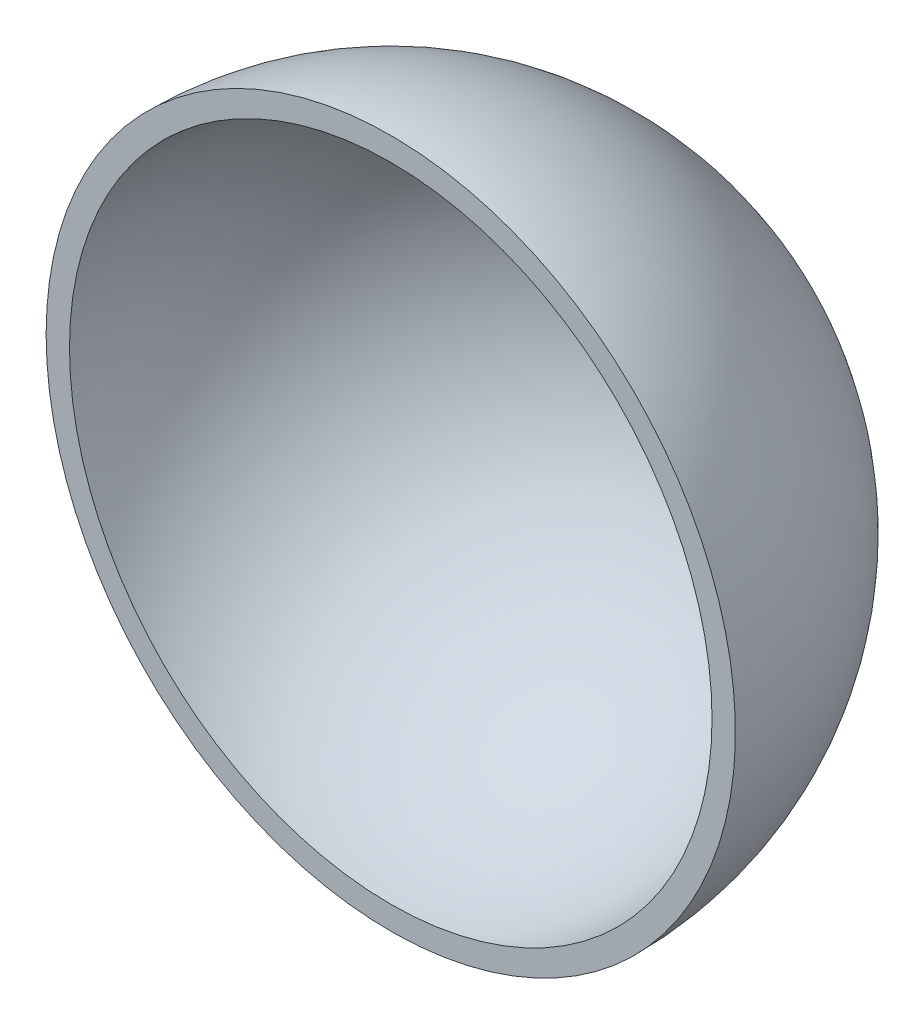
ISO-10303-21;
HEADER;
FILE_DESCRIPTION(('STEP AP214'),'2;1');
FILE_NAME('part.step','',(''),(''),'','','');
FILE_SCHEMA(('AUTOMOTIVE_DESIGN { 1 0 10303 214 1 1 1 1 }'));
ENDSEC;
DATA;
#1=APPLICATION_CONTEXT('core data for automotive mechanical design processes');
#2=APPLICATION_PROTOCOL_DEFINITION('international standard','automotive_design',2000,#1);
#3=PRODUCT_CONTEXT('',#1,'mechanical');
#4=PRODUCT('Part','Part','',(#3));
#5=PRODUCT_RELATED_PRODUCT_CATEGORY('part','',(#4));
#6=PRODUCT_DEFINITION_FORMATION('','',#4);
#7=PRODUCT_DEFINITION_CONTEXT('part definition',#1,'design');
#8=PRODUCT_DEFINITION('design','',#6,#7);
#9=PRODUCT_DEFINITION_SHAPE('','',#8);
#10=(LENGTH_UNIT() NAMED_UNIT(*) SI_UNIT(.MILLI.,.METRE.));
#11=(NAMED_UNIT(*) PLANE_ANGLE_UNIT() SI_UNIT($,.RADIAN.));
#12=(NAMED_UNIT(*) SI_UNIT($,.STERADIAN.) SOLID_ANGLE_UNIT());
#13=UNCERTAINTY_MEASURE_WITH_UNIT(LENGTH_MEASURE(1.E-05),#10,'distance_accuracy_value','');
#14=(GEOMETRIC_REPRESENTATION_CONTEXT(3) GLOBAL_UNCERTAINTY_ASSIGNED_CONTEXT((#13)) GLOBAL_UNIT_ASSIGNED_CONTEXT((#10,
#11,#12)) REPRESENTATION_CONTEXT('',''));
#15=CARTESIAN_POINT('',(0.,0.,0.));
#16=DIRECTION('',(0.,0.,1.));
#17=DIRECTION('',(1.,0.,0.));
#18=AXIS2_PLACEMENT_3D('',#15,#16,#17);
#19=CARTESIAN_POINT('',(0.,0.,0.));
#20=DIRECTION('',(-1.,0.,0.));
#21=DIRECTION('',(0.,-1.,0.));
#22=AXIS2_PLACEMENT_3D('',#19,#20,#21);
#23=SPHERICAL_SURFACE('',#22,110.);
#24=CARTESIAN_POINT('',(0.,0.,0.));
#25=DIRECTION('',(0.,0.,-1.));
#26=DIRECTION('',(1.,0.,0.));
#27=AXIS2_PLACEMENT_3D('',#24,#25,#26);
#28=SPHERICAL_SURFACE('',#27,110.);
#29=CARTESIAN_POINT('',(0.,0.,0.));
#30=DIRECTION('',(0.,0.,-1.));
#31=DIRECTION('',(1.,0.,0.));
#32=AXIS2_PLACEMENT_3D('',#29,#30,#31);
#33=CIRCLE('',#32,110.);
#34=CARTESIAN_POINT('',(110.,0.,0.));
#35=VERTEX_POINT('',#34);
#36=EDGE_CURVE('E49',#35,#35,#33,.F.);
#37=ORIENTED_EDGE('',*,*,#36,.T.);
#38=EDGE_LOOP('',(#37));
#39=FACE_BOUND('',#38,.T.);
#40=ADVANCED_FACE('F41',(#39),#28,.F.);
#41=CARTESIAN_POINT('',(0.,0.,0.));
#42=DIRECTION('',(-1.,0.,0.));
#43=DIRECTION('',(0.,-1.,0.));
#44=AXIS2_PLACEMENT_3D('',#41,#42,#43);
#45=SPHERICAL_SURFACE('',#44,118.);
#46=CARTESIAN_POINT('',(0.,0.,0.));
#47=DIRECTION('',(0.,0.,1.));
#48=DIRECTION('',(-1.,0.,0.));
#49=AXIS2_PLACEMENT_3D('',#46,#47,#48);
#50=SPHERICAL_SURFACE('',#49,118.);
#51=CARTESIAN_POINT('',(0.,0.,0.));
#52=DIRECTION('',(0.,0.,1.));
#53=DIRECTION('',(-1.,0.,0.));
#54=AXIS2_PLACEMENT_3D('',#51,#52,#53);
#55=CIRCLE('',#54,118.);
#56=CARTESIAN_POINT('',(-118.,0.,0.));
#57=VERTEX_POINT('',#56);
#58=EDGE_CURVE('E10',#57,#57,#55,.T.);
#59=ORIENTED_EDGE('',*,*,#58,.F.);
#60=EDGE_LOOP('',(#59));
#61=FACE_BOUND('',#60,.T.);
#62=ADVANCED_FACE('F43',(#61),#50,.T.);
#63=CARTESIAN_POINT('',(0.,0.,0.));
#64=DIRECTION('',(0.,0.,-1.));
#65=DIRECTION('',(1.,0.,0.));
#66=AXIS2_PLACEMENT_3D('',#63,#64,#65);
#67=PLANE('',#66);
#68=ORIENTED_EDGE('',*,*,#36,.F.);
#69=EDGE_LOOP('',(#68));
#70=FACE_BOUND('',#69,.T.);
#71=ORIENTED_EDGE('',*,*,#58,.T.);
#72=EDGE_LOOP('',(#71));
#73=FACE_BOUND('',#72,.T.);
#74=ADVANCED_FACE('F57',(#70,#73),#67,.F.);
#75=CLOSED_SHELL('',(#40,#62,#74));
#76=MANIFOLD_SOLID_BREP('B2',#75);
#77=ADVANCED_BREP_SHAPE_REPRESENTATION('',(#18,#76),#14);
#78=SHAPE_DEFINITION_REPRESENTATION(#9,#77);
ENDSEC;
END-ISO-10303-21;
